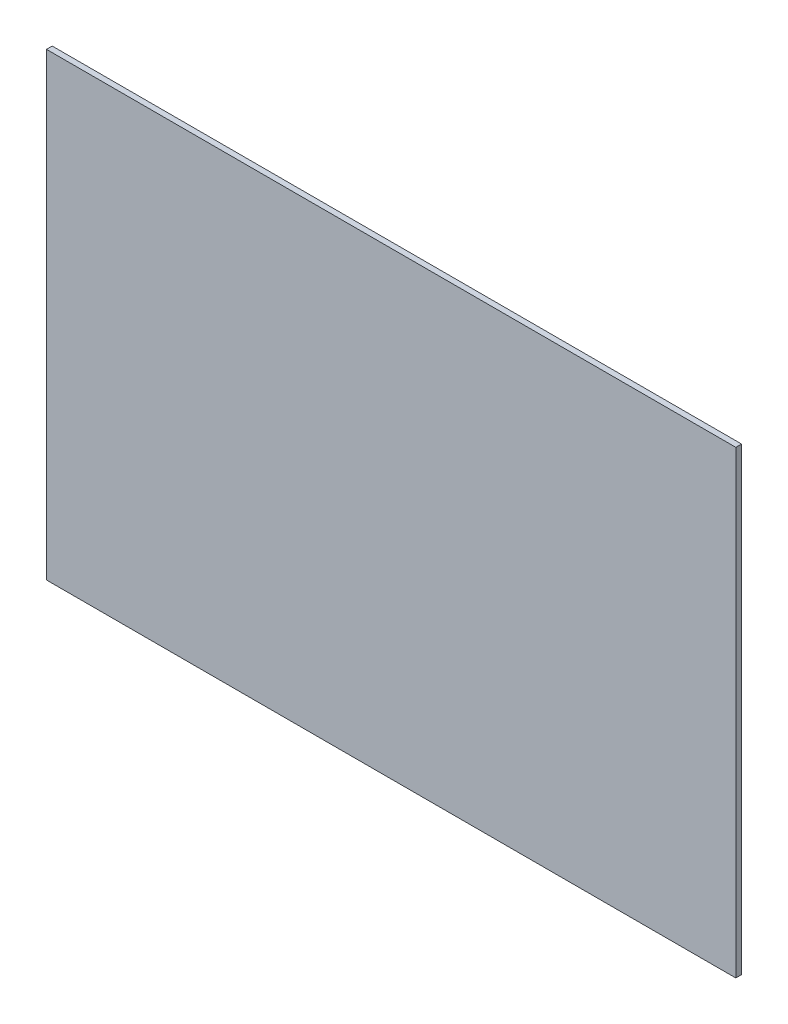
ISO-10303-21;
HEADER;
FILE_DESCRIPTION(('STEP AP214'),'2;1');
FILE_NAME('part.step','',(''),(''),'','','');
FILE_SCHEMA(('AUTOMOTIVE_DESIGN { 1 0 10303 214 1 1 1 1 }'));
ENDSEC;
DATA;
#1=APPLICATION_CONTEXT('core data for automotive mechanical design processes');
#2=APPLICATION_PROTOCOL_DEFINITION('international standard','automotive_design',2000,#1);
#3=PRODUCT_CONTEXT('',#1,'mechanical');
#4=PRODUCT('Part','Part','',(#3));
#5=PRODUCT_RELATED_PRODUCT_CATEGORY('part','',(#4));
#6=PRODUCT_DEFINITION_FORMATION('','',#4);
#7=PRODUCT_DEFINITION_CONTEXT('part definition',#1,'design');
#8=PRODUCT_DEFINITION('design','',#6,#7);
#9=PRODUCT_DEFINITION_SHAPE('','',#8);
#10=(LENGTH_UNIT() NAMED_UNIT(*) SI_UNIT(.MILLI.,.METRE.));
#11=(NAMED_UNIT(*) PLANE_ANGLE_UNIT() SI_UNIT($,.RADIAN.));
#12=(NAMED_UNIT(*) SI_UNIT($,.STERADIAN.) SOLID_ANGLE_UNIT());
#13=UNCERTAINTY_MEASURE_WITH_UNIT(LENGTH_MEASURE(1.E-05),#10,'distance_accuracy_value','');
#14=(GEOMETRIC_REPRESENTATION_CONTEXT(3) GLOBAL_UNCERTAINTY_ASSIGNED_CONTEXT((#13)) GLOBAL_UNIT_ASSIGNED_CONTEXT((#10,
#11,#12)) REPRESENTATION_CONTEXT('',''));
#15=CARTESIAN_POINT('',(0.,0.,0.));
#16=DIRECTION('',(0.,0.,1.));
#17=DIRECTION('',(1.,0.,0.));
#18=AXIS2_PLACEMENT_3D('',#15,#16,#17);
#19=CARTESIAN_POINT('',(762.,-0.01,-0.01));
#20=DIRECTION('',(1.,0.,0.));
#21=DIRECTION('',(0.,1.,0.));
#22=AXIS2_PLACEMENT_3D('',#19,#20,#21);
#23=PLANE('',#22);
#24=DIRECTION('',(0.,1.,0.));
#25=VECTOR('',#24,1.);
#26=CARTESIAN_POINT('',(762.,254.,6.35));
#27=LINE('',#26,#25);
#28=CARTESIAN_POINT('',(762.,0.,6.35));
#29=VERTEX_POINT('',#28);
#30=CARTESIAN_POINT('',(762.,508.,6.35));
#31=VERTEX_POINT('',#30);
#32=EDGE_CURVE('E69',#29,#31,#27,.T.);
#33=ORIENTED_EDGE('',*,*,#32,.F.);
#34=DIRECTION('',(0.,0.,1.));
#35=VECTOR('',#34,1.);
#36=CARTESIAN_POINT('',(762.,0.,3.17500000000001));
#37=LINE('',#36,#35);
#38=CARTESIAN_POINT('',(762.,0.,0.));
#39=VERTEX_POINT('',#38);
#40=EDGE_CURVE('E56',#39,#29,#37,.T.);
#41=ORIENTED_EDGE('',*,*,#40,.F.);
#42=DIRECTION('',(0.,-1.,0.));
#43=VECTOR('',#42,1.);
#44=CARTESIAN_POINT('',(762.,254.,0.));
#45=LINE('',#44,#43);
#46=CARTESIAN_POINT('',(762.,508.,0.));
#47=VERTEX_POINT('',#46);
#48=EDGE_CURVE('E21',#47,#39,#45,.T.);
#49=ORIENTED_EDGE('',*,*,#48,.F.);
#50=DIRECTION('',(0.,0.,-1.));
#51=VECTOR('',#50,1.);
#52=CARTESIAN_POINT('',(762.,508.,3.17500000000001));
#53=LINE('',#52,#51);
#54=EDGE_CURVE('E82',#31,#47,#53,.T.);
#55=ORIENTED_EDGE('',*,*,#54,.F.);
#56=EDGE_LOOP('',(#33,#41,#49,#55));
#57=FACE_BOUND('',#56,.T.);
#58=ADVANCED_FACE('F17',(#57),#23,.T.);
#59=CARTESIAN_POINT('',(762.01,-0.0100000000000122,0.));
#60=DIRECTION('',(0.,0.,-1.));
#61=DIRECTION('',(-1.,0.,0.));
#62=AXIS2_PLACEMENT_3D('',#59,#60,#61);
#63=PLANE('',#62);
#64=DIRECTION('',(-1.,0.,0.));
#65=VECTOR('',#64,1.);
#66=CARTESIAN_POINT('',(381.,508.,0.));
#67=LINE('',#66,#65);
#68=CARTESIAN_POINT('',(0.,508.,0.));
#69=VERTEX_POINT('',#68);
#70=EDGE_CURVE('E65',#47,#69,#67,.T.);
#71=ORIENTED_EDGE('',*,*,#70,.F.);
#72=ORIENTED_EDGE('',*,*,#48,.T.);
#73=DIRECTION('',(1.,0.,0.));
#74=VECTOR('',#73,1.);
#75=CARTESIAN_POINT('',(381.,0.,0.));
#76=LINE('',#75,#74);
#77=CARTESIAN_POINT('',(0.,0.,0.));
#78=VERTEX_POINT('',#77);
#79=EDGE_CURVE('E62',#78,#39,#76,.T.);
#80=ORIENTED_EDGE('',*,*,#79,.F.);
#81=DIRECTION('',(0.,-1.,0.));
#82=VECTOR('',#81,1.);
#83=CARTESIAN_POINT('',(0.,254.,0.));
#84=LINE('',#83,#82);
#85=EDGE_CURVE('E84',#69,#78,#84,.T.);
#86=ORIENTED_EDGE('',*,*,#85,.F.);
#87=EDGE_LOOP('',(#71,#72,#80,#86));
#88=FACE_BOUND('',#87,.T.);
#89=ADVANCED_FACE('F61',(#88),#63,.T.);
#90=CARTESIAN_POINT('',(-0.01,0.,-0.01));
#91=DIRECTION('',(0.,-1.,0.));
#92=DIRECTION('',(1.,0.,0.));
#93=AXIS2_PLACEMENT_3D('',#90,#91,#92);
#94=PLANE('',#93);
#95=DIRECTION('',(1.,0.,0.));
#96=VECTOR('',#95,1.);
#97=CARTESIAN_POINT('',(381.,0.,6.35));
#98=LINE('',#97,#96);
#99=CARTESIAN_POINT('',(0.,0.,6.35));
#100=VERTEX_POINT('',#99);
#101=EDGE_CURVE('E71',#100,#29,#98,.T.);
#102=ORIENTED_EDGE('',*,*,#101,.F.);
#103=DIRECTION('',(0.,0.,1.));
#104=VECTOR('',#103,1.);
#105=CARTESIAN_POINT('',(0.,0.,3.17500000000001));
#106=LINE('',#105,#104);
#107=EDGE_CURVE('E75',#78,#100,#106,.T.);
#108=ORIENTED_EDGE('',*,*,#107,.F.);
#109=ORIENTED_EDGE('',*,*,#79,.T.);
#110=ORIENTED_EDGE('',*,*,#40,.T.);
#111=EDGE_LOOP('',(#102,#108,#109,#110));
#112=FACE_BOUND('',#111,.T.);
#113=ADVANCED_FACE('F73',(#112),#94,.T.);
#114=CARTESIAN_POINT('',(-0.0100000000001188,-0.0100000000000122,6.35));
#115=DIRECTION('',(0.,0.,1.));
#116=DIRECTION('',(1.,0.,0.));
#117=AXIS2_PLACEMENT_3D('',#114,#115,#116);
#118=PLANE('',#117);
#119=DIRECTION('',(1.,0.,0.));
#120=VECTOR('',#119,1.);
#121=CARTESIAN_POINT('',(381.,508.,6.35));
#122=LINE('',#121,#120);
#123=CARTESIAN_POINT('',(-1.56641926639668E-13,508.,6.35));
#124=VERTEX_POINT('',#123);
#125=EDGE_CURVE('E36',#124,#31,#122,.T.);
#126=ORIENTED_EDGE('',*,*,#125,.F.);
#127=DIRECTION('',(0.,1.,0.));
#128=VECTOR('',#127,1.);
#129=CARTESIAN_POINT('',(0.,254.,6.35));
#130=LINE('',#129,#128);
#131=EDGE_CURVE('E27',#100,#124,#130,.T.);
#132=ORIENTED_EDGE('',*,*,#131,.F.);
#133=ORIENTED_EDGE('',*,*,#101,.T.);
#134=ORIENTED_EDGE('',*,*,#32,.T.);
#135=EDGE_LOOP('',(#126,#132,#133,#134));
#136=FACE_BOUND('',#135,.T.);
#137=ADVANCED_FACE('F89',(#136),#118,.T.);
#138=CARTESIAN_POINT('',(762.01,508.,-0.01));
#139=DIRECTION('',(0.,1.,0.));
#140=DIRECTION('',(-1.,0.,0.));
#141=AXIS2_PLACEMENT_3D('',#138,#139,#140);
#142=PLANE('',#141);
#143=ORIENTED_EDGE('',*,*,#125,.T.);
#144=ORIENTED_EDGE('',*,*,#54,.T.);
#145=ORIENTED_EDGE('',*,*,#70,.T.);
#146=DIRECTION('',(0.,0.,-1.));
#147=VECTOR('',#146,1.);
#148=CARTESIAN_POINT('',(-1.55530143491714E-13,508.,3.17500000000001));
#149=LINE('',#148,#147);
#150=EDGE_CURVE('E11',#124,#69,#149,.T.);
#151=ORIENTED_EDGE('',*,*,#150,.F.);
#152=EDGE_LOOP('',(#143,#144,#145,#151));
#153=FACE_BOUND('',#152,.T.);
#154=ADVANCED_FACE('F91',(#153),#142,.T.);
#155=CARTESIAN_POINT('',(-1.55533205108712E-13,508.01,-0.01));
#156=DIRECTION('',(-1.,0.,0.));
#157=DIRECTION('',(0.,-1.,0.));
#158=AXIS2_PLACEMENT_3D('',#155,#156,#157);
#159=PLANE('',#158);
#160=ORIENTED_EDGE('',*,*,#131,.T.);
#161=ORIENTED_EDGE('',*,*,#150,.T.);
#162=ORIENTED_EDGE('',*,*,#85,.T.);
#163=ORIENTED_EDGE('',*,*,#107,.T.);
#164=EDGE_LOOP('',(#160,#161,#162,#163));
#165=FACE_BOUND('',#164,.T.);
#166=ADVANCED_FACE('F19',(#165),#159,.T.);
#167=CLOSED_SHELL('',(#58,#89,#113,#137,#154,#166));
#168=MANIFOLD_SOLID_BREP('B1',#167);
#169=ADVANCED_BREP_SHAPE_REPRESENTATION('',(#18,#168),#14);
#170=SHAPE_DEFINITION_REPRESENTATION(#9,#169);
ENDSEC;
END-ISO-10303-21;
